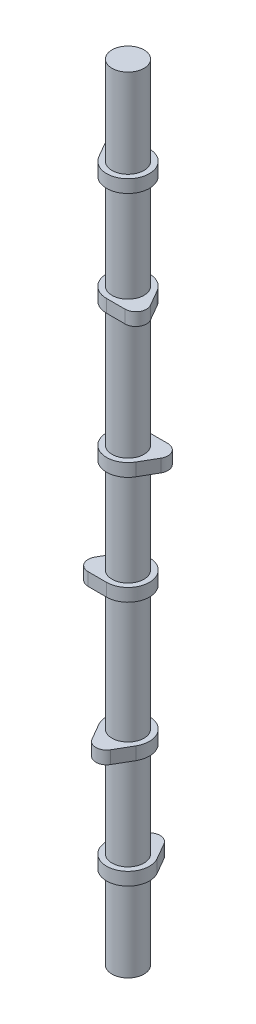
ISO-10303-21;
HEADER;
FILE_DESCRIPTION(('STEP AP214'),'2;1');
FILE_NAME('part.step','',(''),(''),'','','');
FILE_SCHEMA(('AUTOMOTIVE_DESIGN { 1 0 10303 214 1 1 1 1 }'));
ENDSEC;
DATA;
#1=APPLICATION_CONTEXT('core data for automotive mechanical design processes');
#2=APPLICATION_PROTOCOL_DEFINITION('international standard','automotive_design',2000,#1);
#3=PRODUCT_CONTEXT('',#1,'mechanical');
#4=PRODUCT('Part','Part','',(#3));
#5=PRODUCT_RELATED_PRODUCT_CATEGORY('part','',(#4));
#6=PRODUCT_DEFINITION_FORMATION('','',#4);
#7=PRODUCT_DEFINITION_CONTEXT('part definition',#1,'design');
#8=PRODUCT_DEFINITION('design','',#6,#7);
#9=PRODUCT_DEFINITION_SHAPE('','',#8);
#10=(LENGTH_UNIT() NAMED_UNIT(*) SI_UNIT(.MILLI.,.METRE.));
#11=(NAMED_UNIT(*) PLANE_ANGLE_UNIT() SI_UNIT($,.RADIAN.));
#12=(NAMED_UNIT(*) SI_UNIT($,.STERADIAN.) SOLID_ANGLE_UNIT());
#13=UNCERTAINTY_MEASURE_WITH_UNIT(LENGTH_MEASURE(1.E-05),#10,'distance_accuracy_value','');
#14=(GEOMETRIC_REPRESENTATION_CONTEXT(3) GLOBAL_UNCERTAINTY_ASSIGNED_CONTEXT((#13)) GLOBAL_UNIT_ASSIGNED_CONTEXT((#10,
#11,#12)) REPRESENTATION_CONTEXT('',''));
#15=CARTESIAN_POINT('',(0.,0.,0.));
#16=DIRECTION('',(0.,0.,1.));
#17=DIRECTION('',(1.,0.,0.));
#18=AXIS2_PLACEMENT_3D('',#15,#16,#17);
#19=CARTESIAN_POINT('',(0.,416.56,0.));
#20=DIRECTION('',(0.,-1.,0.));
#21=DIRECTION('',(0.,0.,-1.));
#22=AXIS2_PLACEMENT_3D('',#19,#20,#21);
#23=CYLINDRICAL_SURFACE('',#22,9.5);
#24=CARTESIAN_POINT('',(0.,299.72,0.));
#25=DIRECTION('',(0.,1.,0.));
#26=DIRECTION('',(0.,0.,1.));
#27=AXIS2_PLACEMENT_3D('',#24,#25,#26);
#28=CIRCLE('',#27,9.5);
#29=CARTESIAN_POINT('',(0.,299.72,9.5));
#30=VERTEX_POINT('',#29);
#31=EDGE_CURVE('E271',#30,#30,#28,.T.);
#32=ORIENTED_EDGE('',*,*,#31,.T.);
#33=EDGE_LOOP('',(#32));
#34=FACE_BOUND('',#33,.T.);
#35=CARTESIAN_POINT('',(0.,356.35,0.));
#36=DIRECTION('',(0.,1.,0.));
#37=DIRECTION('',(0.,0.,1.));
#38=AXIS2_PLACEMENT_3D('',#35,#36,#37);
#39=CIRCLE('',#38,9.5);
#40=CARTESIAN_POINT('',(0.,356.35,9.5));
#41=VERTEX_POINT('',#40);
#42=EDGE_CURVE('E11',#41,#41,#39,.T.);
#43=ORIENTED_EDGE('',*,*,#42,.F.);
#44=EDGE_LOOP('',(#43));
#45=FACE_BOUND('',#44,.T.);
#46=ADVANCED_FACE('F37',(#34,#45),#23,.T.);
#47=CARTESIAN_POINT('',(0.,217.92,0.));
#48=DIRECTION('',(0.,1.,0.));
#49=DIRECTION('',(0.,0.,1.));
#50=AXIS2_PLACEMENT_3D('',#47,#48,#49);
#51=CIRCLE('',#50,9.5);
#52=CARTESIAN_POINT('',(0.,217.92,9.5));
#53=VERTEX_POINT('',#52);
#54=EDGE_CURVE('E302',#53,#53,#51,.T.);
#55=ORIENTED_EDGE('',*,*,#54,.T.);
#56=EDGE_LOOP('',(#55));
#57=FACE_BOUND('',#56,.T.);
#58=CARTESIAN_POINT('',(0.,292.1,0.));
#59=DIRECTION('',(0.,1.,0.));
#60=DIRECTION('',(0.,0.,1.));
#61=AXIS2_PLACEMENT_3D('',#58,#59,#60);
#62=CIRCLE('',#61,9.5);
#63=CARTESIAN_POINT('',(0.,292.1,9.5));
#64=VERTEX_POINT('',#63);
#65=EDGE_CURVE('E47',#64,#64,#62,.T.);
#66=ORIENTED_EDGE('',*,*,#65,.F.);
#67=EDGE_LOOP('',(#66));
#68=FACE_BOUND('',#67,.T.);
#69=ADVANCED_FACE('F453',(#57,#68),#23,.T.);
#70=CARTESIAN_POINT('',(0.,153.67,0.));
#71=DIRECTION('',(0.,1.,0.));
#72=DIRECTION('',(0.,0.,1.));
#73=AXIS2_PLACEMENT_3D('',#70,#71,#72);
#74=CIRCLE('',#73,9.5);
#75=CARTESIAN_POINT('',(0.,153.67,9.5));
#76=VERTEX_POINT('',#75);
#77=EDGE_CURVE('E333',#76,#76,#74,.T.);
#78=ORIENTED_EDGE('',*,*,#77,.T.);
#79=EDGE_LOOP('',(#78));
#80=FACE_BOUND('',#79,.T.);
#81=CARTESIAN_POINT('',(0.,210.3,0.));
#82=DIRECTION('',(0.,1.,0.));
#83=DIRECTION('',(0.,0.,1.));
#84=AXIS2_PLACEMENT_3D('',#81,#82,#83);
#85=CIRCLE('',#84,9.5);
#86=CARTESIAN_POINT('',(0.,210.3,9.5));
#87=VERTEX_POINT('',#86);
#88=EDGE_CURVE('E406',#87,#87,#85,.T.);
#89=ORIENTED_EDGE('',*,*,#88,.F.);
#90=EDGE_LOOP('',(#89));
#91=FACE_BOUND('',#90,.T.);
#92=ADVANCED_FACE('F459',(#80,#91),#23,.T.);
#93=CARTESIAN_POINT('',(0.,71.87,0.));
#94=DIRECTION('',(0.,1.,0.));
#95=DIRECTION('',(0.,0.,1.));
#96=AXIS2_PLACEMENT_3D('',#93,#94,#95);
#97=CIRCLE('',#96,9.5);
#98=CARTESIAN_POINT('',(0.,71.87,9.5));
#99=VERTEX_POINT('',#98);
#100=EDGE_CURVE('E364',#99,#99,#97,.T.);
#101=ORIENTED_EDGE('',*,*,#100,.T.);
#102=EDGE_LOOP('',(#101));
#103=FACE_BOUND('',#102,.T.);
#104=CARTESIAN_POINT('',(0.,146.05,0.));
#105=DIRECTION('',(0.,1.,0.));
#106=DIRECTION('',(0.,0.,1.));
#107=AXIS2_PLACEMENT_3D('',#104,#105,#106);
#108=CIRCLE('',#107,9.5);
#109=CARTESIAN_POINT('',(0.,146.05,9.5));
#110=VERTEX_POINT('',#109);
#111=EDGE_CURVE('E401',#110,#110,#108,.T.);
#112=ORIENTED_EDGE('',*,*,#111,.F.);
#113=EDGE_LOOP('',(#112));
#114=FACE_BOUND('',#113,.T.);
#115=ADVANCED_FACE('F490',(#103,#114),#23,.T.);
#116=CARTESIAN_POINT('',(0.,7.62000000000002,0.));
#117=DIRECTION('',(0.,1.,0.));
#118=DIRECTION('',(0.,0.,1.));
#119=AXIS2_PLACEMENT_3D('',#116,#117,#118);
#120=CIRCLE('',#119,9.5);
#121=CARTESIAN_POINT('',(0.,7.62000000000002,9.5));
#122=VERTEX_POINT('',#121);
#123=EDGE_CURVE('E368',#122,#122,#120,.F.);
#124=ORIENTED_EDGE('',*,*,#123,.F.);
#125=EDGE_LOOP('',(#124));
#126=FACE_BOUND('',#125,.T.);
#127=CARTESIAN_POINT('',(0.,64.25,0.));
#128=DIRECTION('',(0.,1.,0.));
#129=DIRECTION('',(0.,0.,1.));
#130=AXIS2_PLACEMENT_3D('',#127,#128,#129);
#131=CIRCLE('',#130,9.5);
#132=CARTESIAN_POINT('',(0.,64.25,9.5));
#133=VERTEX_POINT('',#132);
#134=EDGE_CURVE('E398',#133,#133,#131,.T.);
#135=ORIENTED_EDGE('',*,*,#134,.F.);
#136=EDGE_LOOP('',(#135));
#137=FACE_BOUND('',#136,.T.);
#138=ADVANCED_FACE('F478',(#126,#137),#23,.T.);
#139=CARTESIAN_POINT('',(0.,7.62,-12.7));
#140=DIRECTION('',(0.,-1.,0.));
#141=DIRECTION('',(0.,0.,-1.));
#142=AXIS2_PLACEMENT_3D('',#139,#140,#141);
#143=CYLINDRICAL_SURFACE('',#142,6.35);
#144=CARTESIAN_POINT('',(0.,0.,-12.7));
#145=DIRECTION('',(0.,1.,0.));
#146=DIRECTION('',(0.,0.,1.));
#147=AXIS2_PLACEMENT_3D('',#144,#145,#146);
#148=CIRCLE('',#147,6.35);
#149=CARTESIAN_POINT('',(5.49926131403119,0.,-15.875));
#150=VERTEX_POINT('',#149);
#151=CARTESIAN_POINT('',(-5.49926131403118,0.,-15.875));
#152=VERTEX_POINT('',#151);
#153=EDGE_CURVE('E374',#150,#152,#148,.T.);
#154=ORIENTED_EDGE('',*,*,#153,.T.);
#155=DIRECTION('',(0.,-1.,0.));
#156=VECTOR('',#155,1.);
#157=CARTESIAN_POINT('',(-5.49926131403118,7.62,-15.875));
#158=LINE('',#157,#156);
#159=CARTESIAN_POINT('',(-5.49926131403118,7.62,-15.875));
#160=VERTEX_POINT('',#159);
#161=EDGE_CURVE('E393',#160,#152,#158,.T.);
#162=ORIENTED_EDGE('',*,*,#161,.F.);
#163=CARTESIAN_POINT('',(0.,7.62,-12.7));
#164=DIRECTION('',(0.,1.,0.));
#165=DIRECTION('',(0.,0.,1.));
#166=AXIS2_PLACEMENT_3D('',#163,#164,#165);
#167=CIRCLE('',#166,6.35);
#168=CARTESIAN_POINT('',(5.49926131403119,7.62,-15.875));
#169=VERTEX_POINT('',#168);
#170=EDGE_CURVE('E375',#169,#160,#167,.T.);
#171=ORIENTED_EDGE('',*,*,#170,.F.);
#172=DIRECTION('',(0.,-1.,0.));
#173=VECTOR('',#172,1.);
#174=CARTESIAN_POINT('',(5.49926131403119,7.62,-15.875));
#175=LINE('',#174,#173);
#176=EDGE_CURVE('E381',#169,#150,#175,.T.);
#177=ORIENTED_EDGE('',*,*,#176,.T.);
#178=EDGE_LOOP('',(#154,#162,#171,#177));
#179=FACE_BOUND('',#178,.T.);
#180=ADVANCED_FACE('F39',(#179),#143,.T.);
#181=CARTESIAN_POINT('',(-5.49926131403118,7.62,-15.875));
#182=DIRECTION('',(0.866025403784439,0.,0.5));
#183=DIRECTION('',(0.5,0.,-0.866025403784439));
#184=AXIS2_PLACEMENT_3D('',#181,#182,#183);
#185=PLANE('',#184);
#186=DIRECTION('',(-0.5,0.,0.866025403784439));
#187=VECTOR('',#186,1.);
#188=CARTESIAN_POINT('',(-5.49926131403118,0.,-15.875));
#189=LINE('',#188,#187);
#190=CARTESIAN_POINT('',(-10.9985226280624,0.,-6.35000000000001));
#191=VERTEX_POINT('',#190);
#192=EDGE_CURVE('E384',#152,#191,#189,.T.);
#193=ORIENTED_EDGE('',*,*,#192,.T.);
#194=DIRECTION('',(0.,-1.,0.));
#195=VECTOR('',#194,1.);
#196=CARTESIAN_POINT('',(-10.9985226280624,7.62,-6.35000000000001));
#197=LINE('',#196,#195);
#198=CARTESIAN_POINT('',(-10.9985226280624,7.62,-6.35000000000001));
#199=VERTEX_POINT('',#198);
#200=EDGE_CURVE('E391',#199,#191,#197,.T.);
#201=ORIENTED_EDGE('',*,*,#200,.F.);
#202=DIRECTION('',(-0.5,0.,0.866025403784439));
#203=VECTOR('',#202,1.);
#204=CARTESIAN_POINT('',(-5.49926131403118,7.62,-15.875));
#205=LINE('',#204,#203);
#206=EDGE_CURVE('E87',#160,#199,#205,.T.);
#207=ORIENTED_EDGE('',*,*,#206,.F.);
#208=ORIENTED_EDGE('',*,*,#161,.T.);
#209=EDGE_LOOP('',(#193,#201,#207,#208));
#210=FACE_BOUND('',#209,.T.);
#211=ADVANCED_FACE('F496',(#210),#185,.F.);
#212=CARTESIAN_POINT('',(0.,7.62,0.));
#213=DIRECTION('',(0.,-1.,0.));
#214=DIRECTION('',(0.,0.,-1.));
#215=AXIS2_PLACEMENT_3D('',#212,#213,#214);
#216=CYLINDRICAL_SURFACE('',#215,12.7);
#217=CARTESIAN_POINT('',(0.,0.,0.));
#218=DIRECTION('',(0.,1.,0.));
#219=DIRECTION('',(0.,0.,1.));
#220=AXIS2_PLACEMENT_3D('',#217,#218,#219);
#221=CIRCLE('',#220,12.7);
#222=CARTESIAN_POINT('',(10.9985226280624,0.,-6.35));
#223=VERTEX_POINT('',#222);
#224=EDGE_CURVE('E73',#191,#223,#221,.T.);
#225=ORIENTED_EDGE('',*,*,#224,.T.);
#226=DIRECTION('',(0.,-1.,0.));
#227=VECTOR('',#226,1.);
#228=CARTESIAN_POINT('',(10.9985226280624,7.62,-6.35));
#229=LINE('',#228,#227);
#230=CARTESIAN_POINT('',(10.9985226280624,7.62,-6.35));
#231=VERTEX_POINT('',#230);
#232=EDGE_CURVE('E389',#231,#223,#229,.T.);
#233=ORIENTED_EDGE('',*,*,#232,.F.);
#234=CARTESIAN_POINT('',(0.,7.62,0.));
#235=DIRECTION('',(0.,1.,0.));
#236=DIRECTION('',(0.,0.,1.));
#237=AXIS2_PLACEMENT_3D('',#234,#235,#236);
#238=CIRCLE('',#237,12.7);
#239=EDGE_CURVE('E378',#199,#231,#238,.T.);
#240=ORIENTED_EDGE('',*,*,#239,.F.);
#241=ORIENTED_EDGE('',*,*,#200,.T.);
#242=EDGE_LOOP('',(#225,#233,#240,#241));
#243=FACE_BOUND('',#242,.T.);
#244=ADVANCED_FACE('F921',(#243),#216,.T.);
#245=CARTESIAN_POINT('',(5.49926131403119,7.62,-15.875));
#246=DIRECTION('',(-0.866025403784438,0.,0.5));
#247=DIRECTION('',(0.5,0.,0.866025403784438));
#248=AXIS2_PLACEMENT_3D('',#245,#246,#247);
#249=PLANE('',#248);
#250=DIRECTION('',(-0.5,0.,-0.866025403784438));
#251=VECTOR('',#250,1.);
#252=CARTESIAN_POINT('',(5.49926131403119,0.,-15.875));
#253=LINE('',#252,#251);
#254=EDGE_CURVE('E79',#223,#150,#253,.T.);
#255=ORIENTED_EDGE('',*,*,#254,.T.);
#256=ORIENTED_EDGE('',*,*,#176,.F.);
#257=DIRECTION('',(-0.5,0.,-0.866025403784438));
#258=VECTOR('',#257,1.);
#259=CARTESIAN_POINT('',(5.49926131403119,7.62,-15.875));
#260=LINE('',#259,#258);
#261=EDGE_CURVE('E55',#231,#169,#260,.T.);
#262=ORIENTED_EDGE('',*,*,#261,.F.);
#263=ORIENTED_EDGE('',*,*,#232,.T.);
#264=EDGE_LOOP('',(#255,#256,#262,#263));
#265=FACE_BOUND('',#264,.T.);
#266=ADVANCED_FACE('F912',(#265),#249,.F.);
#267=CARTESIAN_POINT('',(0.,7.62,-12.7));
#268=DIRECTION('',(0.,1.,0.));
#269=DIRECTION('',(0.,0.,1.));
#270=AXIS2_PLACEMENT_3D('',#267,#268,#269);
#271=PLANE('',#270);
#272=ORIENTED_EDGE('',*,*,#123,.T.);
#273=EDGE_LOOP('',(#272));
#274=FACE_BOUND('',#273,.T.);
#275=ORIENTED_EDGE('',*,*,#170,.T.);
#276=ORIENTED_EDGE('',*,*,#206,.T.);
#277=ORIENTED_EDGE('',*,*,#239,.T.);
#278=ORIENTED_EDGE('',*,*,#261,.T.);
#279=EDGE_LOOP('',(#275,#276,#277,#278));
#280=FACE_BOUND('',#279,.T.);
#281=ADVANCED_FACE('F902',(#274,#280),#271,.T.);
#282=CARTESIAN_POINT('',(0.,0.,-12.7));
#283=DIRECTION('',(0.,1.,0.));
#284=DIRECTION('',(0.,0.,1.));
#285=AXIS2_PLACEMENT_3D('',#282,#283,#284);
#286=PLANE('',#285);
#287=CARTESIAN_POINT('',(0.,0.,0.));
#288=DIRECTION('',(0.,1.,0.));
#289=DIRECTION('',(0.,0.,1.));
#290=AXIS2_PLACEMENT_3D('',#287,#288,#289);
#291=CIRCLE('',#290,9.5);
#292=CARTESIAN_POINT('',(0.,0.,9.5));
#293=VERTEX_POINT('',#292);
#294=EDGE_CURVE('E395',#293,#293,#291,.F.);
#295=ORIENTED_EDGE('',*,*,#294,.F.);
#296=EDGE_LOOP('',(#295));
#297=FACE_BOUND('',#296,.T.);
#298=ORIENTED_EDGE('',*,*,#153,.F.);
#299=ORIENTED_EDGE('',*,*,#254,.F.);
#300=ORIENTED_EDGE('',*,*,#224,.F.);
#301=ORIENTED_EDGE('',*,*,#192,.F.);
#302=EDGE_LOOP('',(#298,#299,#300,#301));
#303=FACE_BOUND('',#302,.T.);
#304=ADVANCED_FACE('F486',(#297,#303),#286,.F.);
#305=CARTESIAN_POINT('',(0.,-49.53,0.));
#306=DIRECTION('',(0.,1.,0.));
#307=DIRECTION('',(0.,0.,1.));
#308=AXIS2_PLACEMENT_3D('',#305,#306,#307);
#309=PLANE('',#308);
#310=CARTESIAN_POINT('',(0.,-49.53,0.));
#311=DIRECTION('',(0.,1.,0.));
#312=DIRECTION('',(0.,0.,1.));
#313=AXIS2_PLACEMENT_3D('',#310,#311,#312);
#314=CIRCLE('',#313,9.5);
#315=CARTESIAN_POINT('',(0.,-49.53,9.5));
#316=VERTEX_POINT('',#315);
#317=EDGE_CURVE('E369',#316,#316,#314,.T.);
#318=ORIENTED_EDGE('',*,*,#317,.F.);
#319=EDGE_LOOP('',(#318));
#320=FACE_BOUND('',#319,.T.);
#321=ADVANCED_FACE('F476',(#320),#309,.F.);
#322=ORIENTED_EDGE('',*,*,#317,.T.);
#323=EDGE_LOOP('',(#322));
#324=FACE_BOUND('',#323,.T.);
#325=ORIENTED_EDGE('',*,*,#294,.T.);
#326=EDGE_LOOP('',(#325));
#327=FACE_BOUND('',#326,.T.);
#328=ADVANCED_FACE('F466',(#324,#327),#23,.T.);
#329=CARTESIAN_POINT('',(0.,71.87,12.7));
#330=DIRECTION('',(0.,-1.,0.));
#331=DIRECTION('',(0.,0.,1.));
#332=AXIS2_PLACEMENT_3D('',#329,#330,#331);
#333=CYLINDRICAL_SURFACE('',#332,6.35);
#334=CARTESIAN_POINT('',(0.,64.25,12.7));
#335=DIRECTION('',(0.,1.,0.));
#336=DIRECTION('',(0.,0.,-1.));
#337=AXIS2_PLACEMENT_3D('',#334,#335,#336);
#338=CIRCLE('',#337,6.35);
#339=CARTESIAN_POINT('',(-5.4992613140313,64.25,15.875));
#340=VERTEX_POINT('',#339);
#341=CARTESIAN_POINT('',(5.49926131403107,64.25,15.875));
#342=VERTEX_POINT('',#341);
#343=EDGE_CURVE('E345',#340,#342,#338,.T.);
#344=ORIENTED_EDGE('',*,*,#343,.T.);
#345=DIRECTION('',(0.,-1.,0.));
#346=VECTOR('',#345,1.);
#347=CARTESIAN_POINT('',(5.49926131403107,71.87,15.875));
#348=LINE('',#347,#346);
#349=CARTESIAN_POINT('',(5.49926131403107,71.87,15.875));
#350=VERTEX_POINT('',#349);
#351=EDGE_CURVE('E361',#350,#342,#348,.T.);
#352=ORIENTED_EDGE('',*,*,#351,.F.);
#353=CARTESIAN_POINT('',(0.,71.87,12.7));
#354=DIRECTION('',(0.,1.,0.));
#355=DIRECTION('',(0.,0.,-1.));
#356=AXIS2_PLACEMENT_3D('',#353,#354,#355);
#357=CIRCLE('',#356,6.35);
#358=CARTESIAN_POINT('',(-5.4992613140313,71.87,15.875));
#359=VERTEX_POINT('',#358);
#360=EDGE_CURVE('E334',#359,#350,#357,.T.);
#361=ORIENTED_EDGE('',*,*,#360,.F.);
#362=DIRECTION('',(0.,-1.,0.));
#363=VECTOR('',#362,1.);
#364=CARTESIAN_POINT('',(-5.4992613140313,71.87,15.875));
#365=LINE('',#364,#363);
#366=EDGE_CURVE('E344',#359,#340,#365,.T.);
#367=ORIENTED_EDGE('',*,*,#366,.T.);
#368=EDGE_LOOP('',(#344,#352,#361,#367));
#369=FACE_BOUND('',#368,.T.);
#370=ADVANCED_FACE('F475',(#369),#333,.T.);
#371=CARTESIAN_POINT('',(5.49926131403107,71.87,15.875));
#372=DIRECTION('',(-0.866025403784435,0.,-0.500000000000006));
#373=DIRECTION('',(-0.500000000000006,0.,0.866025403784435));
#374=AXIS2_PLACEMENT_3D('',#371,#372,#373);
#375=PLANE('',#374);
#376=DIRECTION('',(0.500000000000006,0.,-0.866025403784435));
#377=VECTOR('',#376,1.);
#378=CARTESIAN_POINT('',(5.49926131403107,64.25,15.875));
#379=LINE('',#378,#377);
#380=CARTESIAN_POINT('',(10.9985226280623,64.25,6.35000000000008));
#381=VERTEX_POINT('',#380);
#382=EDGE_CURVE('E348',#342,#381,#379,.T.);
#383=ORIENTED_EDGE('',*,*,#382,.T.);
#384=DIRECTION('',(0.,-1.,0.));
#385=VECTOR('',#384,1.);
#386=CARTESIAN_POINT('',(10.9985226280623,71.87,6.35000000000008));
#387=LINE('',#386,#385);
#388=CARTESIAN_POINT('',(10.9985226280623,71.87,6.35000000000008));
#389=VERTEX_POINT('',#388);
#390=EDGE_CURVE('E358',#389,#381,#387,.T.);
#391=ORIENTED_EDGE('',*,*,#390,.F.);
#392=DIRECTION('',(0.500000000000006,0.,-0.866025403784435));
#393=VECTOR('',#392,1.);
#394=CARTESIAN_POINT('',(5.49926131403107,71.87,15.875));
#395=LINE('',#394,#393);
#396=EDGE_CURVE('E337',#350,#389,#395,.T.);
#397=ORIENTED_EDGE('',*,*,#396,.F.);
#398=ORIENTED_EDGE('',*,*,#351,.T.);
#399=EDGE_LOOP('',(#383,#391,#397,#398));
#400=FACE_BOUND('',#399,.T.);
#401=ADVANCED_FACE('F483',(#400),#375,.F.);
#402=CARTESIAN_POINT('',(0.,71.87,0.));
#403=DIRECTION('',(0.,-1.,0.));
#404=DIRECTION('',(0.,0.,1.));
#405=AXIS2_PLACEMENT_3D('',#402,#403,#404);
#406=CYLINDRICAL_SURFACE('',#405,12.7);
#407=CARTESIAN_POINT('',(0.,64.25,0.));
#408=DIRECTION('',(0.,1.,0.));
#409=DIRECTION('',(0.,0.,-1.));
#410=AXIS2_PLACEMENT_3D('',#407,#408,#409);
#411=CIRCLE('',#410,12.7);
#412=CARTESIAN_POINT('',(-10.9985226280624,64.25,6.34999999999992));
#413=VERTEX_POINT('',#412);
#414=EDGE_CURVE('E350',#381,#413,#411,.T.);
#415=ORIENTED_EDGE('',*,*,#414,.T.);
#416=DIRECTION('',(0.,-1.,0.));
#417=VECTOR('',#416,1.);
#418=CARTESIAN_POINT('',(-10.9985226280624,71.87,6.34999999999992));
#419=LINE('',#418,#417);
#420=CARTESIAN_POINT('',(-10.9985226280624,71.87,6.34999999999992));
#421=VERTEX_POINT('',#420);
#422=EDGE_CURVE('E355',#421,#413,#419,.T.);
#423=ORIENTED_EDGE('',*,*,#422,.F.);
#424=CARTESIAN_POINT('',(0.,71.87,0.));
#425=DIRECTION('',(0.,1.,0.));
#426=DIRECTION('',(0.,0.,-1.));
#427=AXIS2_PLACEMENT_3D('',#424,#425,#426);
#428=CIRCLE('',#427,12.7);
#429=EDGE_CURVE('E340',#389,#421,#428,.T.);
#430=ORIENTED_EDGE('',*,*,#429,.F.);
#431=ORIENTED_EDGE('',*,*,#390,.T.);
#432=EDGE_LOOP('',(#415,#423,#430,#431));
#433=FACE_BOUND('',#432,.T.);
#434=ADVANCED_FACE('F521',(#433),#406,.T.);
#435=CARTESIAN_POINT('',(-5.4992613140313,71.87,15.875));
#436=DIRECTION('',(0.866025403784442,0.,-0.499999999999994));
#437=DIRECTION('',(-0.499999999999994,0.,-0.866025403784442));
#438=AXIS2_PLACEMENT_3D('',#435,#436,#437);
#439=PLANE('',#438);
#440=DIRECTION('',(0.499999999999994,0.,0.866025403784442));
#441=VECTOR('',#440,1.);
#442=CARTESIAN_POINT('',(-5.4992613140313,64.25,15.875));
#443=LINE('',#442,#441);
#444=EDGE_CURVE('E338',#413,#340,#443,.T.);
#445=ORIENTED_EDGE('',*,*,#444,.T.);
#446=ORIENTED_EDGE('',*,*,#366,.F.);
#447=DIRECTION('',(0.499999999999994,0.,0.866025403784442));
#448=VECTOR('',#447,1.);
#449=CARTESIAN_POINT('',(-5.4992613140313,71.87,15.875));
#450=LINE('',#449,#448);
#451=EDGE_CURVE('E342',#421,#359,#450,.T.);
#452=ORIENTED_EDGE('',*,*,#451,.F.);
#453=ORIENTED_EDGE('',*,*,#422,.T.);
#454=EDGE_LOOP('',(#445,#446,#452,#453));
#455=FACE_BOUND('',#454,.T.);
#456=ADVANCED_FACE('F517',(#455),#439,.F.);
#457=CARTESIAN_POINT('',(0.,71.87,12.7));
#458=DIRECTION('',(0.,1.,0.));
#459=DIRECTION('',(0.,0.,-1.));
#460=AXIS2_PLACEMENT_3D('',#457,#458,#459);
#461=PLANE('',#460);
#462=ORIENTED_EDGE('',*,*,#100,.F.);
#463=EDGE_LOOP('',(#462));
#464=FACE_BOUND('',#463,.T.);
#465=ORIENTED_EDGE('',*,*,#360,.T.);
#466=ORIENTED_EDGE('',*,*,#396,.T.);
#467=ORIENTED_EDGE('',*,*,#429,.T.);
#468=ORIENTED_EDGE('',*,*,#451,.T.);
#469=EDGE_LOOP('',(#465,#466,#467,#468));
#470=FACE_BOUND('',#469,.T.);
#471=ADVANCED_FACE('F507',(#464,#470),#461,.T.);
#472=CARTESIAN_POINT('',(0.,64.25,12.7));
#473=DIRECTION('',(0.,1.,0.));
#474=DIRECTION('',(0.,0.,-1.));
#475=AXIS2_PLACEMENT_3D('',#472,#473,#474);
#476=PLANE('',#475);
#477=ORIENTED_EDGE('',*,*,#134,.T.);
#478=EDGE_LOOP('',(#477));
#479=FACE_BOUND('',#478,.T.);
#480=ORIENTED_EDGE('',*,*,#343,.F.);
#481=ORIENTED_EDGE('',*,*,#444,.F.);
#482=ORIENTED_EDGE('',*,*,#414,.F.);
#483=ORIENTED_EDGE('',*,*,#382,.F.);
#484=EDGE_LOOP('',(#480,#481,#482,#483));
#485=FACE_BOUND('',#484,.T.);
#486=ADVANCED_FACE('F503',(#479,#485),#476,.F.);
#487=CARTESIAN_POINT('',(-10.9985226280623,153.67,6.35000000000005));
#488=DIRECTION('',(0.,-1.,0.));
#489=DIRECTION('',(-0.866025403784436,0.,0.500000000000004));
#490=AXIS2_PLACEMENT_3D('',#487,#488,#489);
#491=CYLINDRICAL_SURFACE('',#490,6.35);
#492=CARTESIAN_POINT('',(-10.9985226280623,146.05,6.35000000000005));
#493=DIRECTION('',(0.,1.,0.));
#494=DIRECTION('',(0.866025403784436,0.,-0.500000000000004));
#495=AXIS2_PLACEMENT_3D('',#492,#493,#494);
#496=CIRCLE('',#495,6.35);
#497=CARTESIAN_POINT('',(-16.4977839420935,146.05,3.17500000000008));
#498=VERTEX_POINT('',#497);
#499=CARTESIAN_POINT('',(-10.9985226280623,146.05,12.7000000000001));
#500=VERTEX_POINT('',#499);
#501=EDGE_CURVE('E314',#498,#500,#496,.T.);
#502=ORIENTED_EDGE('',*,*,#501,.T.);
#503=DIRECTION('',(0.,-1.,0.));
#504=VECTOR('',#503,1.);
#505=CARTESIAN_POINT('',(-10.9985226280623,153.67,12.7000000000001));
#506=LINE('',#505,#504);
#507=CARTESIAN_POINT('',(-10.9985226280623,153.67,12.7000000000001));
#508=VERTEX_POINT('',#507);
#509=EDGE_CURVE('E330',#508,#500,#506,.T.);
#510=ORIENTED_EDGE('',*,*,#509,.F.);
#511=CARTESIAN_POINT('',(-10.9985226280623,153.67,6.35000000000005));
#512=DIRECTION('',(0.,1.,0.));
#513=DIRECTION('',(0.866025403784436,0.,-0.500000000000004));
#514=AXIS2_PLACEMENT_3D('',#511,#512,#513);
#515=CIRCLE('',#514,6.35);
#516=CARTESIAN_POINT('',(-16.4977839420935,153.67,3.17500000000008));
#517=VERTEX_POINT('',#516);
#518=EDGE_CURVE('E303',#517,#508,#515,.T.);
#519=ORIENTED_EDGE('',*,*,#518,.F.);
#520=DIRECTION('',(0.,-1.,0.));
#521=VECTOR('',#520,1.);
#522=CARTESIAN_POINT('',(-16.4977839420935,153.67,3.17500000000008));
#523=LINE('',#522,#521);
#524=EDGE_CURVE('E313',#517,#498,#523,.T.);
#525=ORIENTED_EDGE('',*,*,#524,.T.);
#526=EDGE_LOOP('',(#502,#510,#519,#525));
#527=FACE_BOUND('',#526,.T.);
#528=ADVANCED_FACE('F506',(#527),#491,.T.);
#529=CARTESIAN_POINT('',(-10.9985226280623,153.67,12.7000000000001));
#530=DIRECTION('',(0.,0.,-1.));
#531=DIRECTION('',(-1.,0.,0.));
#532=AXIS2_PLACEMENT_3D('',#529,#530,#531);
#533=PLANE('',#532);
#534=DIRECTION('',(1.,0.,0.));
#535=VECTOR('',#534,1.);
#536=CARTESIAN_POINT('',(-10.9985226280623,146.05,12.7000000000001));
#537=LINE('',#536,#535);
#538=CARTESIAN_POINT('',(0.,146.05,12.7));
#539=VERTEX_POINT('',#538);
#540=EDGE_CURVE('E317',#500,#539,#537,.T.);
#541=ORIENTED_EDGE('',*,*,#540,.T.);
#542=DIRECTION('',(0.,-1.,0.));
#543=VECTOR('',#542,1.);
#544=CARTESIAN_POINT('',(0.,153.67,12.7));
#545=LINE('',#544,#543);
#546=CARTESIAN_POINT('',(0.,153.67,12.7));
#547=VERTEX_POINT('',#546);
#548=EDGE_CURVE('E327',#547,#539,#545,.T.);
#549=ORIENTED_EDGE('',*,*,#548,.F.);
#550=DIRECTION('',(1.,0.,0.));
#551=VECTOR('',#550,1.);
#552=CARTESIAN_POINT('',(-10.9985226280623,153.67,12.7000000000001));
#553=LINE('',#552,#551);
#554=EDGE_CURVE('E306',#508,#547,#553,.T.);
#555=ORIENTED_EDGE('',*,*,#554,.F.);
#556=ORIENTED_EDGE('',*,*,#509,.T.);
#557=EDGE_LOOP('',(#541,#549,#555,#556));
#558=FACE_BOUND('',#557,.T.);
#559=ADVANCED_FACE('F573',(#558),#533,.F.);
#560=CARTESIAN_POINT('',(0.,153.67,0.));
#561=DIRECTION('',(0.,-1.,0.));
#562=DIRECTION('',(-0.866025403784436,0.,0.500000000000004));
#563=AXIS2_PLACEMENT_3D('',#560,#561,#562);
#564=CYLINDRICAL_SURFACE('',#563,12.7);
#565=CARTESIAN_POINT('',(0.,146.05,0.));
#566=DIRECTION('',(0.,1.,0.));
#567=DIRECTION('',(0.866025403784436,0.,-0.500000000000004));
#568=AXIS2_PLACEMENT_3D('',#565,#566,#567);
#569=CIRCLE('',#568,12.7);
#570=CARTESIAN_POINT('',(-10.9985226280624,146.05,-6.34999999999995));
#571=VERTEX_POINT('',#570);
#572=EDGE_CURVE('E319',#539,#571,#569,.T.);
#573=ORIENTED_EDGE('',*,*,#572,.T.);
#574=DIRECTION('',(0.,-1.,0.));
#575=VECTOR('',#574,1.);
#576=CARTESIAN_POINT('',(-10.9985226280624,153.67,-6.34999999999995));
#577=LINE('',#576,#575);
#578=CARTESIAN_POINT('',(-10.9985226280624,153.67,-6.34999999999995));
#579=VERTEX_POINT('',#578);
#580=EDGE_CURVE('E324',#579,#571,#577,.T.);
#581=ORIENTED_EDGE('',*,*,#580,.F.);
#582=CARTESIAN_POINT('',(0.,153.67,0.));
#583=DIRECTION('',(0.,1.,0.));
#584=DIRECTION('',(0.866025403784436,0.,-0.500000000000004));
#585=AXIS2_PLACEMENT_3D('',#582,#583,#584);
#586=CIRCLE('',#585,12.7);
#587=EDGE_CURVE('E309',#547,#579,#586,.T.);
#588=ORIENTED_EDGE('',*,*,#587,.F.);
#589=ORIENTED_EDGE('',*,*,#548,.T.);
#590=EDGE_LOOP('',(#573,#581,#588,#589));
#591=FACE_BOUND('',#590,.T.);
#592=ADVANCED_FACE('F583',(#591),#564,.T.);
#593=CARTESIAN_POINT('',(-16.4977839420935,153.67,3.17500000000008));
#594=DIRECTION('',(0.866025403784441,0.,0.499999999999996));
#595=DIRECTION('',(0.499999999999996,0.,-0.866025403784441));
#596=AXIS2_PLACEMENT_3D('',#593,#594,#595);
#597=PLANE('',#596);
#598=DIRECTION('',(-0.499999999999996,0.,0.866025403784441));
#599=VECTOR('',#598,1.);
#600=CARTESIAN_POINT('',(-16.4977839420935,146.05,3.17500000000008));
#601=LINE('',#600,#599);
#602=EDGE_CURVE('E307',#571,#498,#601,.T.);
#603=ORIENTED_EDGE('',*,*,#602,.T.);
#604=ORIENTED_EDGE('',*,*,#524,.F.);
#605=DIRECTION('',(-0.499999999999996,0.,0.866025403784441));
#606=VECTOR('',#605,1.);
#607=CARTESIAN_POINT('',(-16.4977839420935,153.67,3.17500000000008));
#608=LINE('',#607,#606);
#609=EDGE_CURVE('E311',#579,#517,#608,.T.);
#610=ORIENTED_EDGE('',*,*,#609,.F.);
#611=ORIENTED_EDGE('',*,*,#580,.T.);
#612=EDGE_LOOP('',(#603,#604,#610,#611));
#613=FACE_BOUND('',#612,.T.);
#614=ADVANCED_FACE('F593',(#613),#597,.F.);
#615=CARTESIAN_POINT('',(-10.9985226280623,153.67,6.35000000000005));
#616=DIRECTION('',(0.,1.,0.));
#617=DIRECTION('',(0.866025403784436,0.,-0.500000000000004));
#618=AXIS2_PLACEMENT_3D('',#615,#616,#617);
#619=PLANE('',#618);
#620=ORIENTED_EDGE('',*,*,#77,.F.);
#621=EDGE_LOOP('',(#620));
#622=FACE_BOUND('',#621,.T.);
#623=ORIENTED_EDGE('',*,*,#518,.T.);
#624=ORIENTED_EDGE('',*,*,#554,.T.);
#625=ORIENTED_EDGE('',*,*,#587,.T.);
#626=ORIENTED_EDGE('',*,*,#609,.T.);
#627=EDGE_LOOP('',(#623,#624,#625,#626));
#628=FACE_BOUND('',#627,.T.);
#629=ADVANCED_FACE('F604',(#622,#628),#619,.T.);
#630=CARTESIAN_POINT('',(-10.9985226280623,146.05,6.35000000000005));
#631=DIRECTION('',(0.,1.,0.));
#632=DIRECTION('',(0.866025403784436,0.,-0.500000000000004));
#633=AXIS2_PLACEMENT_3D('',#630,#631,#632);
#634=PLANE('',#633);
#635=ORIENTED_EDGE('',*,*,#111,.T.);
#636=EDGE_LOOP('',(#635));
#637=FACE_BOUND('',#636,.T.);
#638=ORIENTED_EDGE('',*,*,#501,.F.);
#639=ORIENTED_EDGE('',*,*,#602,.F.);
#640=ORIENTED_EDGE('',*,*,#572,.F.);
#641=ORIENTED_EDGE('',*,*,#540,.F.);
#642=EDGE_LOOP('',(#638,#639,#640,#641));
#643=FACE_BOUND('',#642,.T.);
#644=ADVANCED_FACE('F615',(#637,#643),#634,.F.);
#645=CARTESIAN_POINT('',(10.9985226280624,217.92,-6.34999999999997));
#646=DIRECTION('',(0.,-1.,0.));
#647=DIRECTION('',(0.86602540378444,0.,-0.499999999999998));
#648=AXIS2_PLACEMENT_3D('',#645,#646,#647);
#649=CYLINDRICAL_SURFACE('',#648,6.35);
#650=CARTESIAN_POINT('',(10.9985226280624,210.3,-6.34999999999997));
#651=DIRECTION('',(0.,1.,0.));
#652=DIRECTION('',(-0.86602540378444,0.,0.499999999999998));
#653=AXIS2_PLACEMENT_3D('',#650,#651,#652);
#654=CIRCLE('',#653,6.35);
#655=CARTESIAN_POINT('',(16.4977839420936,210.3,-3.17499999999996));
#656=VERTEX_POINT('',#655);
#657=CARTESIAN_POINT('',(10.9985226280624,210.3,-12.7));
#658=VERTEX_POINT('',#657);
#659=EDGE_CURVE('E283',#656,#658,#654,.T.);
#660=ORIENTED_EDGE('',*,*,#659,.T.);
#661=DIRECTION('',(0.,-1.,0.));
#662=VECTOR('',#661,1.);
#663=CARTESIAN_POINT('',(10.9985226280624,217.92,-12.7));
#664=LINE('',#663,#662);
#665=CARTESIAN_POINT('',(10.9985226280624,217.92,-12.7));
#666=VERTEX_POINT('',#665);
#667=EDGE_CURVE('E299',#666,#658,#664,.T.);
#668=ORIENTED_EDGE('',*,*,#667,.F.);
#669=CARTESIAN_POINT('',(10.9985226280624,217.92,-6.34999999999997));
#670=DIRECTION('',(0.,1.,0.));
#671=DIRECTION('',(-0.86602540378444,0.,0.499999999999998));
#672=AXIS2_PLACEMENT_3D('',#669,#670,#671);
#673=CIRCLE('',#672,6.35);
#674=CARTESIAN_POINT('',(16.4977839420936,217.92,-3.17499999999996));
#675=VERTEX_POINT('',#674);
#676=EDGE_CURVE('E272',#675,#666,#673,.T.);
#677=ORIENTED_EDGE('',*,*,#676,.F.);
#678=DIRECTION('',(0.,-1.,0.));
#679=VECTOR('',#678,1.);
#680=CARTESIAN_POINT('',(16.4977839420936,217.92,-3.17499999999996));
#681=LINE('',#680,#679);
#682=EDGE_CURVE('E282',#675,#656,#681,.T.);
#683=ORIENTED_EDGE('',*,*,#682,.T.);
#684=EDGE_LOOP('',(#660,#668,#677,#683));
#685=FACE_BOUND('',#684,.T.);
#686=ADVANCED_FACE('F626',(#685),#649,.T.);
#687=CARTESIAN_POINT('',(10.9985226280624,217.92,-12.7));
#688=DIRECTION('',(0.,0.,1.));
#689=DIRECTION('',(1.,0.,0.));
#690=AXIS2_PLACEMENT_3D('',#687,#688,#689);
#691=PLANE('',#690);
#692=DIRECTION('',(-1.,0.,0.));
#693=VECTOR('',#692,1.);
#694=CARTESIAN_POINT('',(10.9985226280624,210.3,-12.7));
#695=LINE('',#694,#693);
#696=CARTESIAN_POINT('',(0.,210.3,-12.7));
#697=VERTEX_POINT('',#696);
#698=EDGE_CURVE('E286',#658,#697,#695,.T.);
#699=ORIENTED_EDGE('',*,*,#698,.T.);
#700=DIRECTION('',(0.,-1.,0.));
#701=VECTOR('',#700,1.);
#702=CARTESIAN_POINT('',(0.,217.92,-12.7));
#703=LINE('',#702,#701);
#704=CARTESIAN_POINT('',(0.,217.92,-12.7));
#705=VERTEX_POINT('',#704);
#706=EDGE_CURVE('E296',#705,#697,#703,.T.);
#707=ORIENTED_EDGE('',*,*,#706,.F.);
#708=DIRECTION('',(-1.,0.,0.));
#709=VECTOR('',#708,1.);
#710=CARTESIAN_POINT('',(10.9985226280624,217.92,-12.7));
#711=LINE('',#710,#709);
#712=EDGE_CURVE('E275',#666,#705,#711,.T.);
#713=ORIENTED_EDGE('',*,*,#712,.F.);
#714=ORIENTED_EDGE('',*,*,#667,.T.);
#715=EDGE_LOOP('',(#699,#707,#713,#714));
#716=FACE_BOUND('',#715,.T.);
#717=ADVANCED_FACE('F637',(#716),#691,.F.);
#718=CARTESIAN_POINT('',(0.,217.92,0.));
#719=DIRECTION('',(0.,-1.,0.));
#720=DIRECTION('',(0.86602540378444,0.,-0.499999999999998));
#721=AXIS2_PLACEMENT_3D('',#718,#719,#720);
#722=CYLINDRICAL_SURFACE('',#721,12.7);
#723=CARTESIAN_POINT('',(0.,210.3,0.));
#724=DIRECTION('',(0.,1.,0.));
#725=DIRECTION('',(-0.86602540378444,0.,0.499999999999998));
#726=AXIS2_PLACEMENT_3D('',#723,#724,#725);
#727=CIRCLE('',#726,12.7);
#728=CARTESIAN_POINT('',(10.9985226280624,210.3,6.35000000000003));
#729=VERTEX_POINT('',#728);
#730=EDGE_CURVE('E288',#697,#729,#727,.T.);
#731=ORIENTED_EDGE('',*,*,#730,.T.);
#732=DIRECTION('',(0.,-1.,0.));
#733=VECTOR('',#732,1.);
#734=CARTESIAN_POINT('',(10.9985226280624,217.92,6.35000000000003));
#735=LINE('',#734,#733);
#736=CARTESIAN_POINT('',(10.9985226280624,217.92,6.35000000000003));
#737=VERTEX_POINT('',#736);
#738=EDGE_CURVE('E293',#737,#729,#735,.T.);
#739=ORIENTED_EDGE('',*,*,#738,.F.);
#740=CARTESIAN_POINT('',(0.,217.92,0.));
#741=DIRECTION('',(0.,1.,0.));
#742=DIRECTION('',(-0.86602540378444,0.,0.499999999999998));
#743=AXIS2_PLACEMENT_3D('',#740,#741,#742);
#744=CIRCLE('',#743,12.7);
#745=EDGE_CURVE('E278',#705,#737,#744,.T.);
#746=ORIENTED_EDGE('',*,*,#745,.F.);
#747=ORIENTED_EDGE('',*,*,#706,.T.);
#748=EDGE_LOOP('',(#731,#739,#746,#747));
#749=FACE_BOUND('',#748,.T.);
#750=ADVANCED_FACE('F648',(#749),#722,.T.);
#751=CARTESIAN_POINT('',(16.4977839420936,217.92,-3.17499999999996));
#752=DIRECTION('',(-0.866025403784438,0.,-0.500000000000002));
#753=DIRECTION('',(-0.500000000000002,0.,0.866025403784438));
#754=AXIS2_PLACEMENT_3D('',#751,#752,#753);
#755=PLANE('',#754);
#756=DIRECTION('',(0.500000000000002,0.,-0.866025403784438));
#757=VECTOR('',#756,1.);
#758=CARTESIAN_POINT('',(16.4977839420936,210.3,-3.17499999999996));
#759=LINE('',#758,#757);
#760=EDGE_CURVE('E276',#729,#656,#759,.T.);
#761=ORIENTED_EDGE('',*,*,#760,.T.);
#762=ORIENTED_EDGE('',*,*,#682,.F.);
#763=DIRECTION('',(0.500000000000002,0.,-0.866025403784438));
#764=VECTOR('',#763,1.);
#765=CARTESIAN_POINT('',(16.4977839420936,217.92,-3.17499999999996));
#766=LINE('',#765,#764);
#767=EDGE_CURVE('E280',#737,#675,#766,.T.);
#768=ORIENTED_EDGE('',*,*,#767,.F.);
#769=ORIENTED_EDGE('',*,*,#738,.T.);
#770=EDGE_LOOP('',(#761,#762,#768,#769));
#771=FACE_BOUND('',#770,.T.);
#772=ADVANCED_FACE('F659',(#771),#755,.F.);
#773=CARTESIAN_POINT('',(10.9985226280624,217.92,-6.34999999999997));
#774=DIRECTION('',(0.,1.,0.));
#775=DIRECTION('',(-0.86602540378444,0.,0.499999999999998));
#776=AXIS2_PLACEMENT_3D('',#773,#774,#775);
#777=PLANE('',#776);
#778=ORIENTED_EDGE('',*,*,#54,.F.);
#779=EDGE_LOOP('',(#778));
#780=FACE_BOUND('',#779,.T.);
#781=ORIENTED_EDGE('',*,*,#676,.T.);
#782=ORIENTED_EDGE('',*,*,#712,.T.);
#783=ORIENTED_EDGE('',*,*,#745,.T.);
#784=ORIENTED_EDGE('',*,*,#767,.T.);
#785=EDGE_LOOP('',(#781,#782,#783,#784));
#786=FACE_BOUND('',#785,.T.);
#787=ADVANCED_FACE('F670',(#780,#786),#777,.T.);
#788=CARTESIAN_POINT('',(10.9985226280624,210.3,-6.34999999999997));
#789=DIRECTION('',(0.,1.,0.));
#790=DIRECTION('',(-0.86602540378444,0.,0.499999999999998));
#791=AXIS2_PLACEMENT_3D('',#788,#789,#790);
#792=PLANE('',#791);
#793=ORIENTED_EDGE('',*,*,#88,.T.);
#794=EDGE_LOOP('',(#793));
#795=FACE_BOUND('',#794,.T.);
#796=ORIENTED_EDGE('',*,*,#659,.F.);
#797=ORIENTED_EDGE('',*,*,#760,.F.);
#798=ORIENTED_EDGE('',*,*,#730,.F.);
#799=ORIENTED_EDGE('',*,*,#698,.F.);
#800=EDGE_LOOP('',(#796,#797,#798,#799));
#801=FACE_BOUND('',#800,.T.);
#802=ADVANCED_FACE('F681',(#795,#801),#792,.F.);
#803=CARTESIAN_POINT('',(10.9985226280624,299.72,6.3499999999999));
#804=DIRECTION('',(0.,-1.,0.));
#805=DIRECTION('',(0.866025403784443,0.,0.499999999999992));
#806=AXIS2_PLACEMENT_3D('',#803,#804,#805);
#807=CYLINDRICAL_SURFACE('',#806,6.35);
#808=CARTESIAN_POINT('',(10.9985226280624,292.1,6.3499999999999));
#809=DIRECTION('',(0.,1.,0.));
#810=DIRECTION('',(-0.866025403784443,0.,-0.499999999999992));
#811=AXIS2_PLACEMENT_3D('',#808,#809,#810);
#812=CIRCLE('',#811,6.35);
#813=CARTESIAN_POINT('',(10.9985226280625,292.1,12.6999999999999));
#814=VERTEX_POINT('',#813);
#815=CARTESIAN_POINT('',(16.4977839420936,292.1,3.17499999999985));
#816=VERTEX_POINT('',#815);
#817=EDGE_CURVE('E237',#814,#816,#812,.T.);
#818=ORIENTED_EDGE('',*,*,#817,.T.);
#819=DIRECTION('',(0.,-1.,0.));
#820=VECTOR('',#819,1.);
#821=CARTESIAN_POINT('',(16.4977839420936,299.72,3.17499999999985));
#822=LINE('',#821,#820);
#823=CARTESIAN_POINT('',(16.4977839420936,299.72,3.17499999999985));
#824=VERTEX_POINT('',#823);
#825=EDGE_CURVE('E268',#824,#816,#822,.T.);
#826=ORIENTED_EDGE('',*,*,#825,.F.);
#827=CARTESIAN_POINT('',(10.9985226280624,299.72,6.3499999999999));
#828=DIRECTION('',(0.,1.,0.));
#829=DIRECTION('',(-0.866025403784443,0.,-0.499999999999992));
#830=AXIS2_PLACEMENT_3D('',#827,#828,#829);
#831=CIRCLE('',#830,6.35);
#832=CARTESIAN_POINT('',(10.9985226280625,299.72,12.6999999999999));
#833=VERTEX_POINT('',#832);
#834=EDGE_CURVE('E242',#833,#824,#831,.T.);
#835=ORIENTED_EDGE('',*,*,#834,.F.);
#836=DIRECTION('',(0.,-1.,0.));
#837=VECTOR('',#836,1.);
#838=CARTESIAN_POINT('',(10.9985226280625,299.72,12.6999999999999));
#839=LINE('',#838,#837);
#840=EDGE_CURVE('E252',#833,#814,#839,.T.);
#841=ORIENTED_EDGE('',*,*,#840,.T.);
#842=EDGE_LOOP('',(#818,#826,#835,#841));
#843=FACE_BOUND('',#842,.T.);
#844=ADVANCED_FACE('F432',(#843),#807,.T.);
#845=CARTESIAN_POINT('',(16.4977839420936,299.72,3.17499999999985));
#846=DIRECTION('',(-0.866025403784434,0.,0.500000000000008));
#847=DIRECTION('',(0.500000000000008,0.,0.866025403784434));
#848=AXIS2_PLACEMENT_3D('',#845,#846,#847);
#849=PLANE('',#848);
#850=DIRECTION('',(-0.500000000000008,0.,-0.866025403784434));
#851=VECTOR('',#850,1.);
#852=CARTESIAN_POINT('',(16.4977839420936,292.1,3.17499999999985));
#853=LINE('',#852,#851);
#854=CARTESIAN_POINT('',(10.9985226280623,292.1,-6.3500000000001));
#855=VERTEX_POINT('',#854);
#856=EDGE_CURVE('E255',#816,#855,#853,.T.);
#857=ORIENTED_EDGE('',*,*,#856,.T.);
#858=DIRECTION('',(0.,-1.,0.));
#859=VECTOR('',#858,1.);
#860=CARTESIAN_POINT('',(10.9985226280623,299.72,-6.3500000000001));
#861=LINE('',#860,#859);
#862=CARTESIAN_POINT('',(10.9985226280623,299.72,-6.3500000000001));
#863=VERTEX_POINT('',#862);
#864=EDGE_CURVE('E265',#863,#855,#861,.T.);
#865=ORIENTED_EDGE('',*,*,#864,.F.);
#866=DIRECTION('',(-0.500000000000008,0.,-0.866025403784434));
#867=VECTOR('',#866,1.);
#868=CARTESIAN_POINT('',(16.4977839420936,299.72,3.17499999999985));
#869=LINE('',#868,#867);
#870=EDGE_CURVE('E245',#824,#863,#869,.T.);
#871=ORIENTED_EDGE('',*,*,#870,.F.);
#872=ORIENTED_EDGE('',*,*,#825,.T.);
#873=EDGE_LOOP('',(#857,#865,#871,#872));
#874=FACE_BOUND('',#873,.T.);
#875=ADVANCED_FACE('F435',(#874),#849,.F.);
#876=CARTESIAN_POINT('',(0.,299.72,0.));
#877=DIRECTION('',(0.,-1.,0.));
#878=DIRECTION('',(0.866025403784443,0.,0.499999999999992));
#879=AXIS2_PLACEMENT_3D('',#876,#877,#878);
#880=CYLINDRICAL_SURFACE('',#879,12.7);
#881=CARTESIAN_POINT('',(0.,292.1,0.));
#882=DIRECTION('',(0.,1.,0.));
#883=DIRECTION('',(-0.866025403784443,0.,-0.499999999999992));
#884=AXIS2_PLACEMENT_3D('',#881,#882,#883);
#885=CIRCLE('',#884,12.7);
#886=CARTESIAN_POINT('',(1.16226472890446E-13,292.1,12.7));
#887=VERTEX_POINT('',#886);
#888=EDGE_CURVE('E257',#855,#887,#885,.T.);
#889=ORIENTED_EDGE('',*,*,#888,.T.);
#890=DIRECTION('',(0.,-1.,0.));
#891=VECTOR('',#890,1.);
#892=CARTESIAN_POINT('',(1.16226472890446E-13,299.72,12.7));
#893=LINE('',#892,#891);
#894=CARTESIAN_POINT('',(1.16226472890446E-13,299.72,12.7));
#895=VERTEX_POINT('',#894);
#896=EDGE_CURVE('E262',#895,#887,#893,.T.);
#897=ORIENTED_EDGE('',*,*,#896,.F.);
#898=CARTESIAN_POINT('',(0.,299.72,0.));
#899=DIRECTION('',(0.,1.,0.));
#900=DIRECTION('',(-0.866025403784443,0.,-0.499999999999992));
#901=AXIS2_PLACEMENT_3D('',#898,#899,#900);
#902=CIRCLE('',#901,12.7);
#903=EDGE_CURVE('E248',#863,#895,#902,.T.);
#904=ORIENTED_EDGE('',*,*,#903,.F.);
#905=ORIENTED_EDGE('',*,*,#864,.T.);
#906=EDGE_LOOP('',(#889,#897,#904,#905));
#907=FACE_BOUND('',#906,.T.);
#908=ADVANCED_FACE('F440',(#907),#880,.T.);
#909=CARTESIAN_POINT('',(10.9985226280625,299.72,12.6999999999999));
#910=DIRECTION('',(0.,0.,-1.));
#911=DIRECTION('',(-1.,0.,0.));
#912=AXIS2_PLACEMENT_3D('',#909,#910,#911);
#913=PLANE('',#912);
#914=DIRECTION('',(1.,0.,0.));
#915=VECTOR('',#914,1.);
#916=CARTESIAN_POINT('',(10.9985226280625,292.1,12.6999999999999));
#917=LINE('',#916,#915);
#918=EDGE_CURVE('E246',#887,#814,#917,.T.);
#919=ORIENTED_EDGE('',*,*,#918,.T.);
#920=ORIENTED_EDGE('',*,*,#840,.F.);
#921=DIRECTION('',(1.,0.,0.));
#922=VECTOR('',#921,1.);
#923=CARTESIAN_POINT('',(10.9985226280625,299.72,12.6999999999999));
#924=LINE('',#923,#922);
#925=EDGE_CURVE('E250',#895,#833,#924,.T.);
#926=ORIENTED_EDGE('',*,*,#925,.F.);
#927=ORIENTED_EDGE('',*,*,#896,.T.);
#928=EDGE_LOOP('',(#919,#920,#926,#927));
#929=FACE_BOUND('',#928,.T.);
#930=ADVANCED_FACE('F424',(#929),#913,.F.);
#931=CARTESIAN_POINT('',(10.9985226280624,299.72,6.3499999999999));
#932=DIRECTION('',(0.,1.,0.));
#933=DIRECTION('',(-0.866025403784443,0.,-0.499999999999992));
#934=AXIS2_PLACEMENT_3D('',#931,#932,#933);
#935=PLANE('',#934);
#936=ORIENTED_EDGE('',*,*,#31,.F.);
#937=EDGE_LOOP('',(#936));
#938=FACE_BOUND('',#937,.T.);
#939=ORIENTED_EDGE('',*,*,#834,.T.);
#940=ORIENTED_EDGE('',*,*,#870,.T.);
#941=ORIENTED_EDGE('',*,*,#903,.T.);
#942=ORIENTED_EDGE('',*,*,#925,.T.);
#943=EDGE_LOOP('',(#939,#940,#941,#942));
#944=FACE_BOUND('',#943,.T.);
#945=ADVANCED_FACE('F420',(#938,#944),#935,.T.);
#946=CARTESIAN_POINT('',(10.9985226280624,292.1,6.3499999999999));
#947=DIRECTION('',(0.,1.,0.));
#948=DIRECTION('',(-0.866025403784443,0.,-0.499999999999992));
#949=AXIS2_PLACEMENT_3D('',#946,#947,#948);
#950=PLANE('',#949);
#951=ORIENTED_EDGE('',*,*,#65,.T.);
#952=EDGE_LOOP('',(#951));
#953=FACE_BOUND('',#952,.T.);
#954=ORIENTED_EDGE('',*,*,#817,.F.);
#955=ORIENTED_EDGE('',*,*,#918,.F.);
#956=ORIENTED_EDGE('',*,*,#888,.F.);
#957=ORIENTED_EDGE('',*,*,#856,.F.);
#958=EDGE_LOOP('',(#954,#955,#956,#957));
#959=FACE_BOUND('',#958,.T.);
#960=ADVANCED_FACE('F423',(#953,#959),#950,.F.);
#961=CARTESIAN_POINT('',(-10.9985226280624,363.97,-6.34999999999997));
#962=DIRECTION('',(0.,-1.,0.));
#963=DIRECTION('',(-0.86602540378444,0.,-0.499999999999998));
#964=AXIS2_PLACEMENT_3D('',#961,#962,#963);
#965=CYLINDRICAL_SURFACE('',#964,6.35);
#966=CARTESIAN_POINT('',(-10.9985226280624,356.35,-6.34999999999997));
#967=DIRECTION('',(0.,1.,0.));
#968=DIRECTION('',(0.86602540378444,0.,0.499999999999998));
#969=AXIS2_PLACEMENT_3D('',#966,#967,#968);
#970=CIRCLE('',#969,6.35);
#971=CARTESIAN_POINT('',(-10.9985226280624,356.35,-12.7));
#972=VERTEX_POINT('',#971);
#973=CARTESIAN_POINT('',(-16.4977839420936,356.35,-3.17499999999996));
#974=VERTEX_POINT('',#973);
#975=EDGE_CURVE('E234',#972,#974,#970,.T.);
#976=ORIENTED_EDGE('',*,*,#975,.T.);
#977=DIRECTION('',(0.,-1.,0.));
#978=VECTOR('',#977,1.);
#979=CARTESIAN_POINT('',(-16.4977839420936,363.97,-3.17499999999996));
#980=LINE('',#979,#978);
#981=CARTESIAN_POINT('',(-16.4977839420936,363.97,-3.17499999999996));
#982=VERTEX_POINT('',#981);
#983=EDGE_CURVE('E214',#982,#974,#980,.T.);
#984=ORIENTED_EDGE('',*,*,#983,.F.);
#985=CARTESIAN_POINT('',(-10.9985226280624,363.97,-6.34999999999997));
#986=DIRECTION('',(0.,1.,0.));
#987=DIRECTION('',(0.86602540378444,0.,0.499999999999998));
#988=AXIS2_PLACEMENT_3D('',#985,#986,#987);
#989=CIRCLE('',#988,6.35);
#990=CARTESIAN_POINT('',(-10.9985226280624,363.97,-12.7));
#991=VERTEX_POINT('',#990);
#992=EDGE_CURVE('E221',#991,#982,#989,.T.);
#993=ORIENTED_EDGE('',*,*,#992,.F.);
#994=DIRECTION('',(0.,-1.,0.));
#995=VECTOR('',#994,1.);
#996=CARTESIAN_POINT('',(-10.9985226280624,363.97,-12.7));
#997=LINE('',#996,#995);
#998=EDGE_CURVE('E1016',#991,#972,#997,.T.);
#999=ORIENTED_EDGE('',*,*,#998,.T.);
#1000=EDGE_LOOP('',(#976,#984,#993,#999));
#1001=FACE_BOUND('',#1000,.T.);
#1002=ADVANCED_FACE('F232',(#1001),#965,.T.);
#1003=CARTESIAN_POINT('',(-16.4977839420936,363.97,-3.17499999999996));
#1004=DIRECTION('',(0.866025403784437,0.,-0.500000000000002));
#1005=DIRECTION('',(-0.500000000000002,0.,-0.866025403784437));
#1006=AXIS2_PLACEMENT_3D('',#1003,#1004,#1005);
#1007=PLANE('',#1006);
#1008=DIRECTION('',(0.500000000000002,0.,0.866025403784437));
#1009=VECTOR('',#1008,1.);
#1010=CARTESIAN_POINT('',(-16.4977839420936,356.35,-3.17499999999996));
#1011=LINE('',#1010,#1009);
#1012=CARTESIAN_POINT('',(-10.9985226280624,356.35,6.35000000000002));
#1013=VERTEX_POINT('',#1012);
#1014=EDGE_CURVE('E1007',#974,#1013,#1011,.T.);
#1015=ORIENTED_EDGE('',*,*,#1014,.T.);
#1016=DIRECTION('',(0.,-1.,0.));
#1017=VECTOR('',#1016,1.);
#1018=CARTESIAN_POINT('',(-10.9985226280624,363.97,6.35000000000002));
#1019=LINE('',#1018,#1017);
#1020=CARTESIAN_POINT('',(-10.9985226280624,363.97,6.35000000000002));
#1021=VERTEX_POINT('',#1020);
#1022=EDGE_CURVE('E217',#1021,#1013,#1019,.T.);
#1023=ORIENTED_EDGE('',*,*,#1022,.F.);
#1024=DIRECTION('',(0.500000000000002,0.,0.866025403784437));
#1025=VECTOR('',#1024,1.);
#1026=CARTESIAN_POINT('',(-16.4977839420936,363.97,-3.17499999999996));
#1027=LINE('',#1026,#1025);
#1028=EDGE_CURVE('E210',#982,#1021,#1027,.T.);
#1029=ORIENTED_EDGE('',*,*,#1028,.F.);
#1030=ORIENTED_EDGE('',*,*,#983,.T.);
#1031=EDGE_LOOP('',(#1015,#1023,#1029,#1030));
#1032=FACE_BOUND('',#1031,.T.);
#1033=ADVANCED_FACE('F212',(#1032),#1007,.F.);
#1034=CARTESIAN_POINT('',(0.,363.97,0.));
#1035=DIRECTION('',(0.,-1.,0.));
#1036=DIRECTION('',(-0.86602540378444,0.,-0.499999999999998));
#1037=AXIS2_PLACEMENT_3D('',#1034,#1035,#1036);
#1038=CYLINDRICAL_SURFACE('',#1037,12.7);
#1039=CARTESIAN_POINT('',(0.,356.35,0.));
#1040=DIRECTION('',(0.,1.,0.));
#1041=DIRECTION('',(0.86602540378444,0.,0.499999999999998));
#1042=AXIS2_PLACEMENT_3D('',#1039,#1040,#1041);
#1043=CIRCLE('',#1042,12.7);
#1044=CARTESIAN_POINT('',(0.,356.35,-12.7));
#1045=VERTEX_POINT('',#1044);
#1046=EDGE_CURVE('E1009',#1013,#1045,#1043,.T.);
#1047=ORIENTED_EDGE('',*,*,#1046,.T.);
#1048=DIRECTION('',(0.,-1.,0.));
#1049=VECTOR('',#1048,1.);
#1050=CARTESIAN_POINT('',(0.,363.97,-12.7));
#1051=LINE('',#1050,#1049);
#1052=CARTESIAN_POINT('',(0.,363.97,-12.7));
#1053=VERTEX_POINT('',#1052);
#1054=EDGE_CURVE('E238',#1053,#1045,#1051,.T.);
#1055=ORIENTED_EDGE('',*,*,#1054,.F.);
#1056=CARTESIAN_POINT('',(0.,363.97,0.));
#1057=DIRECTION('',(0.,1.,0.));
#1058=DIRECTION('',(0.86602540378444,0.,0.499999999999998));
#1059=AXIS2_PLACEMENT_3D('',#1056,#1057,#1058);
#1060=CIRCLE('',#1059,12.7);
#1061=EDGE_CURVE('E220',#1021,#1053,#1060,.T.);
#1062=ORIENTED_EDGE('',*,*,#1061,.F.);
#1063=ORIENTED_EDGE('',*,*,#1022,.T.);
#1064=EDGE_LOOP('',(#1047,#1055,#1062,#1063));
#1065=FACE_BOUND('',#1064,.T.);
#1066=ADVANCED_FACE('F756',(#1065),#1038,.T.);
#1067=CARTESIAN_POINT('',(-10.9985226280624,363.97,-12.7));
#1068=DIRECTION('',(0.,0.,1.));
#1069=DIRECTION('',(1.,0.,0.));
#1070=AXIS2_PLACEMENT_3D('',#1067,#1068,#1069);
#1071=PLANE('',#1070);
#1072=DIRECTION('',(-1.,0.,0.));
#1073=VECTOR('',#1072,1.);
#1074=CARTESIAN_POINT('',(-10.9985226280624,356.35,-12.7));
#1075=LINE('',#1074,#1073);
#1076=EDGE_CURVE('E230',#1045,#972,#1075,.T.);
#1077=ORIENTED_EDGE('',*,*,#1076,.T.);
#1078=ORIENTED_EDGE('',*,*,#998,.F.);
#1079=DIRECTION('',(-1.,0.,0.));
#1080=VECTOR('',#1079,1.);
#1081=CARTESIAN_POINT('',(-10.9985226280624,363.97,-12.7));
#1082=LINE('',#1081,#1080);
#1083=EDGE_CURVE('E226',#1053,#991,#1082,.T.);
#1084=ORIENTED_EDGE('',*,*,#1083,.F.);
#1085=ORIENTED_EDGE('',*,*,#1054,.T.);
#1086=EDGE_LOOP('',(#1077,#1078,#1084,#1085));
#1087=FACE_BOUND('',#1086,.T.);
#1088=ADVANCED_FACE('F766',(#1087),#1071,.F.);
#1089=CARTESIAN_POINT('',(-10.9985226280624,363.97,-6.34999999999997));
#1090=DIRECTION('',(0.,1.,0.));
#1091=DIRECTION('',(0.86602540378444,0.,0.499999999999998));
#1092=AXIS2_PLACEMENT_3D('',#1089,#1090,#1091);
#1093=PLANE('',#1092);
#1094=CARTESIAN_POINT('',(0.,363.97,0.));
#1095=DIRECTION('',(0.,1.,0.));
#1096=DIRECTION('',(0.,0.,1.));
#1097=AXIS2_PLACEMENT_3D('',#1094,#1095,#1096);
#1098=CIRCLE('',#1097,9.5);
#1099=CARTESIAN_POINT('',(0.,363.97,9.5));
#1100=VERTEX_POINT('',#1099);
#1101=EDGE_CURVE('E41',#1100,#1100,#1098,.T.);
#1102=ORIENTED_EDGE('',*,*,#1101,.F.);
#1103=EDGE_LOOP('',(#1102));
#1104=FACE_BOUND('',#1103,.T.);
#1105=ORIENTED_EDGE('',*,*,#992,.T.);
#1106=ORIENTED_EDGE('',*,*,#1028,.T.);
#1107=ORIENTED_EDGE('',*,*,#1061,.T.);
#1108=ORIENTED_EDGE('',*,*,#1083,.T.);
#1109=EDGE_LOOP('',(#1105,#1106,#1107,#1108));
#1110=FACE_BOUND('',#1109,.T.);
#1111=ADVANCED_FACE('F224',(#1104,#1110),#1093,.T.);
#1112=CARTESIAN_POINT('',(-10.9985226280624,356.35,-6.34999999999997));
#1113=DIRECTION('',(0.,1.,0.));
#1114=DIRECTION('',(0.86602540378444,0.,0.499999999999998));
#1115=AXIS2_PLACEMENT_3D('',#1112,#1113,#1114);
#1116=PLANE('',#1115);
#1117=ORIENTED_EDGE('',*,*,#42,.T.);
#1118=EDGE_LOOP('',(#1117));
#1119=FACE_BOUND('',#1118,.T.);
#1120=ORIENTED_EDGE('',*,*,#975,.F.);
#1121=ORIENTED_EDGE('',*,*,#1076,.F.);
#1122=ORIENTED_EDGE('',*,*,#1046,.F.);
#1123=ORIENTED_EDGE('',*,*,#1014,.F.);
#1124=EDGE_LOOP('',(#1120,#1121,#1122,#1123));
#1125=FACE_BOUND('',#1124,.T.);
#1126=ADVANCED_FACE('F470',(#1119,#1125),#1116,.F.);
#1127=CARTESIAN_POINT('',(0.,416.56,0.));
#1128=DIRECTION('',(0.,1.,0.));
#1129=DIRECTION('',(0.,0.,1.));
#1130=AXIS2_PLACEMENT_3D('',#1127,#1128,#1129);
#1131=PLANE('',#1130);
#1132=CARTESIAN_POINT('',(0.,416.56,0.));
#1133=DIRECTION('',(0.,1.,0.));
#1134=DIRECTION('',(0.,0.,1.));
#1135=AXIS2_PLACEMENT_3D('',#1132,#1133,#1134);
#1136=CIRCLE('',#1135,9.5);
#1137=CARTESIAN_POINT('',(0.,416.56,9.5));
#1138=VERTEX_POINT('',#1137);
#1139=EDGE_CURVE('E365',#1138,#1138,#1136,.T.);
#1140=ORIENTED_EDGE('',*,*,#1139,.T.);
#1141=EDGE_LOOP('',(#1140));
#1142=FACE_BOUND('',#1141,.T.);
#1143=ADVANCED_FACE('F464',(#1142),#1131,.T.);
#1144=ORIENTED_EDGE('',*,*,#1101,.T.);
#1145=EDGE_LOOP('',(#1144));
#1146=FACE_BOUND('',#1145,.T.);
#1147=ORIENTED_EDGE('',*,*,#1139,.F.);
#1148=EDGE_LOOP('',(#1147));
#1149=FACE_BOUND('',#1148,.T.);
#1150=ADVANCED_FACE('F455',(#1146,#1149),#23,.T.);
#1151=CLOSED_SHELL('',(#46,#69,#92,#115,#138,#180,#211,#244,#266,#281,#304,#321,#328,#370,#401,
#434,#456,#471,#486,#528,#559,#592,#614,#629,#644,#686,#717,#750,#772,#787,#802,#844,#875,#908,
#930,#945,#960,#1002,#1033,#1066,#1088,#1111,#1126,#1143,#1150));
#1152=MANIFOLD_SOLID_BREP('B2',#1151);
#1153=ADVANCED_BREP_SHAPE_REPRESENTATION('',(#18,#1152),#14);
#1154=SHAPE_DEFINITION_REPRESENTATION(#9,#1153);
ENDSEC;
END-ISO-10303-21;
